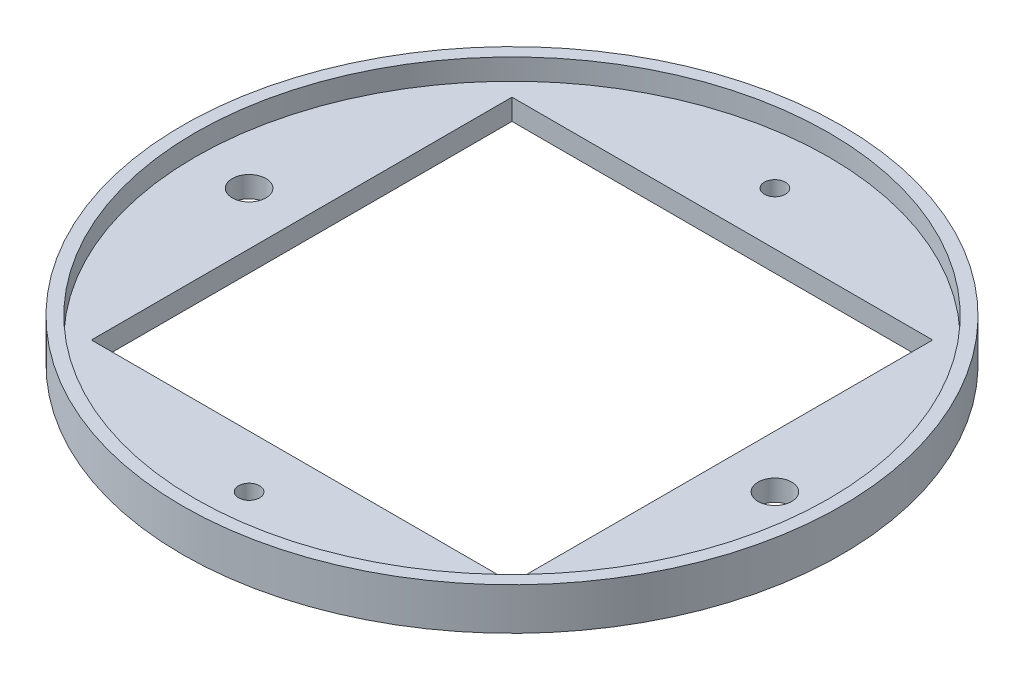
ISO-10303-21;
HEADER;
FILE_DESCRIPTION(('STEP AP214'),'2;1');
FILE_NAME('part.step','',(''),(''),'','','');
FILE_SCHEMA(('AUTOMOTIVE_DESIGN { 1 0 10303 214 1 1 1 1 }'));
ENDSEC;
DATA;
#1=APPLICATION_CONTEXT('core data for automotive mechanical design processes');
#2=APPLICATION_PROTOCOL_DEFINITION('international standard','automotive_design',2000,#1);
#3=PRODUCT_CONTEXT('',#1,'mechanical');
#4=PRODUCT('Part','Part','',(#3));
#5=PRODUCT_RELATED_PRODUCT_CATEGORY('part','',(#4));
#6=PRODUCT_DEFINITION_FORMATION('','',#4);
#7=PRODUCT_DEFINITION_CONTEXT('part definition',#1,'design');
#8=PRODUCT_DEFINITION('design','',#6,#7);
#9=PRODUCT_DEFINITION_SHAPE('','',#8);
#10=(LENGTH_UNIT() NAMED_UNIT(*) SI_UNIT(.MILLI.,.METRE.));
#11=(NAMED_UNIT(*) PLANE_ANGLE_UNIT() SI_UNIT($,.RADIAN.));
#12=(NAMED_UNIT(*) SI_UNIT($,.STERADIAN.) SOLID_ANGLE_UNIT());
#13=UNCERTAINTY_MEASURE_WITH_UNIT(LENGTH_MEASURE(1.E-05),#10,'distance_accuracy_value','');
#14=(GEOMETRIC_REPRESENTATION_CONTEXT(3) GLOBAL_UNCERTAINTY_ASSIGNED_CONTEXT((#13)) GLOBAL_UNIT_ASSIGNED_CONTEXT((#10,
#11,#12)) REPRESENTATION_CONTEXT('',''));
#15=CARTESIAN_POINT('',(0.,0.,0.));
#16=DIRECTION('',(0.,0.,1.));
#17=DIRECTION('',(1.,0.,0.));
#18=AXIS2_PLACEMENT_3D('',#15,#16,#17);
#19=CARTESIAN_POINT('',(0.,5.,0.));
#20=DIRECTION('',(0.,1.,0.));
#21=DIRECTION('',(0.,0.,1.));
#22=AXIS2_PLACEMENT_3D('',#19,#20,#21);
#23=PLANE('',#22);
#24=CARTESIAN_POINT('',(0.,5.,62.5));
#25=DIRECTION('',(0.,1.,0.));
#26=DIRECTION('',(0.,0.,1.));
#27=AXIS2_PLACEMENT_3D('',#24,#25,#26);
#28=CIRCLE('',#27,2.5);
#29=CARTESIAN_POINT('',(0.,5.,65.));
#30=VERTEX_POINT('',#29);
#31=EDGE_CURVE('E157',#30,#30,#28,.T.);
#32=ORIENTED_EDGE('',*,*,#31,.F.);
#33=EDGE_LOOP('',(#32));
#34=FACE_BOUND('',#33,.T.);
#35=CARTESIAN_POINT('',(62.5,5.,0.));
#36=DIRECTION('',(0.,1.,0.));
#37=DIRECTION('',(0.,0.,1.));
#38=AXIS2_PLACEMENT_3D('',#35,#36,#37);
#39=CIRCLE('',#38,4.00000000000001);
#40=CARTESIAN_POINT('',(62.5,5.,4.00000000000001));
#41=VERTEX_POINT('',#40);
#42=EDGE_CURVE('E174',#41,#41,#39,.T.);
#43=ORIENTED_EDGE('',*,*,#42,.F.);
#44=EDGE_LOOP('',(#43));
#45=FACE_BOUND('',#44,.T.);
#46=DIRECTION('',(-1.,0.,0.));
#47=VECTOR('',#46,1.);
#48=CARTESIAN_POINT('',(-50.,5.,-50.));
#49=LINE('',#48,#47);
#50=CARTESIAN_POINT('',(50.,5.,-50.));
#51=VERTEX_POINT('',#50);
#52=CARTESIAN_POINT('',(-50.,5.,-50.));
#53=VERTEX_POINT('',#52);
#54=EDGE_CURVE('E90',#51,#53,#49,.T.);
#55=ORIENTED_EDGE('',*,*,#54,.F.);
#56=DIRECTION('',(0.,0.,-1.));
#57=VECTOR('',#56,1.);
#58=CARTESIAN_POINT('',(50.,5.,50.));
#59=LINE('',#58,#57);
#60=CARTESIAN_POINT('',(50.,5.,50.));
#61=VERTEX_POINT('',#60);
#62=EDGE_CURVE('E81',#61,#51,#59,.T.);
#63=ORIENTED_EDGE('',*,*,#62,.F.);
#64=DIRECTION('',(1.,0.,0.));
#65=VECTOR('',#64,1.);
#66=CARTESIAN_POINT('',(-50.,5.,50.));
#67=LINE('',#66,#65);
#68=CARTESIAN_POINT('',(-50.,5.,50.));
#69=VERTEX_POINT('',#68);
#70=EDGE_CURVE('E107',#69,#61,#67,.T.);
#71=ORIENTED_EDGE('',*,*,#70,.F.);
#72=DIRECTION('',(0.,0.,1.));
#73=VECTOR('',#72,1.);
#74=CARTESIAN_POINT('',(-50.,5.,50.));
#75=LINE('',#74,#73);
#76=EDGE_CURVE('E103',#53,#69,#75,.T.);
#77=ORIENTED_EDGE('',*,*,#76,.F.);
#78=EDGE_LOOP('',(#55,#63,#71,#77));
#79=FACE_BOUND('',#78,.T.);
#80=CARTESIAN_POINT('',(-62.5,5.,0.));
#81=DIRECTION('',(0.,1.,0.));
#82=DIRECTION('',(0.,0.,1.));
#83=AXIS2_PLACEMENT_3D('',#80,#81,#82);
#84=CIRCLE('',#83,4.00000000000001);
#85=CARTESIAN_POINT('',(-62.5,5.,4.00000000000001));
#86=VERTEX_POINT('',#85);
#87=EDGE_CURVE('E115',#86,#86,#84,.T.);
#88=ORIENTED_EDGE('',*,*,#87,.F.);
#89=EDGE_LOOP('',(#88));
#90=FACE_BOUND('',#89,.T.);
#91=CARTESIAN_POINT('',(0.,5.,-62.5));
#92=DIRECTION('',(0.,1.,0.));
#93=DIRECTION('',(0.,0.,1.));
#94=AXIS2_PLACEMENT_3D('',#91,#92,#93);
#95=CIRCLE('',#94,2.5);
#96=CARTESIAN_POINT('',(0.,5.,-60.));
#97=VERTEX_POINT('',#96);
#98=EDGE_CURVE('E168',#97,#97,#95,.T.);
#99=ORIENTED_EDGE('',*,*,#98,.F.);
#100=EDGE_LOOP('',(#99));
#101=FACE_BOUND('',#100,.T.);
#102=CARTESIAN_POINT('',(0.,5.,0.));
#103=DIRECTION('',(0.,1.,0.));
#104=DIRECTION('',(0.,0.,1.));
#105=AXIS2_PLACEMENT_3D('',#102,#103,#104);
#106=CIRCLE('',#105,75.35);
#107=CARTESIAN_POINT('',(0.,5.,75.35));
#108=VERTEX_POINT('',#107);
#109=EDGE_CURVE('E11',#108,#108,#106,.F.);
#110=ORIENTED_EDGE('',*,*,#109,.F.);
#111=EDGE_LOOP('',(#110));
#112=FACE_BOUND('',#111,.T.);
#113=ADVANCED_FACE('F39',(#34,#45,#79,#90,#101,#112),#23,.T.);
#114=CARTESIAN_POINT('',(0.,0.,0.));
#115=DIRECTION('',(0.,1.,0.));
#116=DIRECTION('',(0.,0.,1.));
#117=AXIS2_PLACEMENT_3D('',#114,#115,#116);
#118=PLANE('',#117);
#119=CARTESIAN_POINT('',(0.,0.,0.));
#120=DIRECTION('',(0.,1.,0.));
#121=DIRECTION('',(0.,0.,1.));
#122=AXIS2_PLACEMENT_3D('',#119,#120,#121);
#123=CIRCLE('',#122,78.35);
#124=CARTESIAN_POINT('',(0.,0.,78.35));
#125=VERTEX_POINT('',#124);
#126=EDGE_CURVE('E48',#125,#125,#123,.T.);
#127=ORIENTED_EDGE('',*,*,#126,.F.);
#128=EDGE_LOOP('',(#127));
#129=FACE_BOUND('',#128,.T.);
#130=DIRECTION('',(0.,0.,-1.));
#131=VECTOR('',#130,1.);
#132=CARTESIAN_POINT('',(50.,0.,50.));
#133=LINE('',#132,#131);
#134=CARTESIAN_POINT('',(50.,0.,50.));
#135=VERTEX_POINT('',#134);
#136=CARTESIAN_POINT('',(50.,0.,-50.));
#137=VERTEX_POINT('',#136);
#138=EDGE_CURVE('E63',#135,#137,#133,.T.);
#139=ORIENTED_EDGE('',*,*,#138,.T.);
#140=DIRECTION('',(-1.,0.,0.));
#141=VECTOR('',#140,1.);
#142=CARTESIAN_POINT('',(-50.,0.,-50.));
#143=LINE('',#142,#141);
#144=CARTESIAN_POINT('',(-50.,0.,-50.));
#145=VERTEX_POINT('',#144);
#146=EDGE_CURVE('E97',#137,#145,#143,.T.);
#147=ORIENTED_EDGE('',*,*,#146,.T.);
#148=DIRECTION('',(0.,0.,1.));
#149=VECTOR('',#148,1.);
#150=CARTESIAN_POINT('',(-50.,0.,50.));
#151=LINE('',#150,#149);
#152=CARTESIAN_POINT('',(-50.,0.,50.));
#153=VERTEX_POINT('',#152);
#154=EDGE_CURVE('E118',#145,#153,#151,.T.);
#155=ORIENTED_EDGE('',*,*,#154,.T.);
#156=DIRECTION('',(1.,0.,0.));
#157=VECTOR('',#156,1.);
#158=CARTESIAN_POINT('',(-50.,0.,50.));
#159=LINE('',#158,#157);
#160=EDGE_CURVE('E91',#153,#135,#159,.T.);
#161=ORIENTED_EDGE('',*,*,#160,.T.);
#162=EDGE_LOOP('',(#139,#147,#155,#161));
#163=FACE_BOUND('',#162,.T.);
#164=CARTESIAN_POINT('',(-62.5,0.,0.));
#165=DIRECTION('',(0.,1.,0.));
#166=DIRECTION('',(0.,0.,1.));
#167=AXIS2_PLACEMENT_3D('',#164,#165,#166);
#168=CIRCLE('',#167,4.00000000000001);
#169=CARTESIAN_POINT('',(-62.5,0.,4.00000000000001));
#170=VERTEX_POINT('',#169);
#171=EDGE_CURVE('E143',#170,#170,#168,.T.);
#172=ORIENTED_EDGE('',*,*,#171,.T.);
#173=EDGE_LOOP('',(#172));
#174=FACE_BOUND('',#173,.T.);
#175=CARTESIAN_POINT('',(62.5,0.,0.));
#176=DIRECTION('',(0.,1.,0.));
#177=DIRECTION('',(0.,0.,1.));
#178=AXIS2_PLACEMENT_3D('',#175,#176,#177);
#179=CIRCLE('',#178,4.00000000000001);
#180=CARTESIAN_POINT('',(62.5,0.,4.00000000000001));
#181=VERTEX_POINT('',#180);
#182=EDGE_CURVE('E147',#181,#181,#179,.T.);
#183=ORIENTED_EDGE('',*,*,#182,.T.);
#184=EDGE_LOOP('',(#183));
#185=FACE_BOUND('',#184,.T.);
#186=CARTESIAN_POINT('',(0.,0.,-62.5));
#187=DIRECTION('',(0.,1.,0.));
#188=DIRECTION('',(0.,0.,1.));
#189=AXIS2_PLACEMENT_3D('',#186,#187,#188);
#190=CIRCLE('',#189,2.5);
#191=CARTESIAN_POINT('',(0.,0.,-60.));
#192=VERTEX_POINT('',#191);
#193=EDGE_CURVE('E151',#192,#192,#190,.T.);
#194=ORIENTED_EDGE('',*,*,#193,.T.);
#195=EDGE_LOOP('',(#194));
#196=FACE_BOUND('',#195,.T.);
#197=CARTESIAN_POINT('',(0.,0.,62.5));
#198=DIRECTION('',(0.,1.,0.));
#199=DIRECTION('',(0.,0.,1.));
#200=AXIS2_PLACEMENT_3D('',#197,#198,#199);
#201=CIRCLE('',#200,2.5);
#202=CARTESIAN_POINT('',(0.,0.,65.));
#203=VERTEX_POINT('',#202);
#204=EDGE_CURVE('E154',#203,#203,#201,.T.);
#205=ORIENTED_EDGE('',*,*,#204,.T.);
#206=EDGE_LOOP('',(#205));
#207=FACE_BOUND('',#206,.T.);
#208=ADVANCED_FACE('F136',(#129,#163,#174,#185,#196,#207),#118,.F.);
#209=CARTESIAN_POINT('',(0.,5.,0.));
#210=DIRECTION('',(0.,-1.,0.));
#211=DIRECTION('',(0.,0.,-1.));
#212=AXIS2_PLACEMENT_3D('',#209,#210,#211);
#213=CYLINDRICAL_SURFACE('',#212,78.35);
#214=ORIENTED_EDGE('',*,*,#126,.T.);
#215=EDGE_LOOP('',(#214));
#216=FACE_BOUND('',#215,.T.);
#217=CARTESIAN_POINT('',(0.,10.,0.));
#218=DIRECTION('',(0.,1.,0.));
#219=DIRECTION('',(0.,0.,1.));
#220=AXIS2_PLACEMENT_3D('',#217,#218,#219);
#221=CIRCLE('',#220,78.35);
#222=CARTESIAN_POINT('',(0.,10.,78.35));
#223=VERTEX_POINT('',#222);
#224=EDGE_CURVE('E158',#223,#223,#221,.T.);
#225=ORIENTED_EDGE('',*,*,#224,.F.);
#226=EDGE_LOOP('',(#225));
#227=FACE_BOUND('',#226,.T.);
#228=ADVANCED_FACE('F41',(#216,#227),#213,.T.);
#229=CARTESIAN_POINT('',(50.,5.,50.));
#230=DIRECTION('',(-1.,0.,0.));
#231=DIRECTION('',(0.,0.,1.));
#232=AXIS2_PLACEMENT_3D('',#229,#230,#231);
#233=PLANE('',#232);
#234=ORIENTED_EDGE('',*,*,#138,.F.);
#235=DIRECTION('',(0.,-1.,0.));
#236=VECTOR('',#235,1.);
#237=CARTESIAN_POINT('',(50.,5.,50.));
#238=LINE('',#237,#236);
#239=EDGE_CURVE('E85',#61,#135,#238,.T.);
#240=ORIENTED_EDGE('',*,*,#239,.F.);
#241=ORIENTED_EDGE('',*,*,#62,.T.);
#242=DIRECTION('',(0.,-1.,0.));
#243=VECTOR('',#242,1.);
#244=CARTESIAN_POINT('',(50.,5.,-50.));
#245=LINE('',#244,#243);
#246=EDGE_CURVE('E84',#51,#137,#245,.T.);
#247=ORIENTED_EDGE('',*,*,#246,.T.);
#248=EDGE_LOOP('',(#234,#240,#241,#247));
#249=FACE_BOUND('',#248,.T.);
#250=ADVANCED_FACE('F83',(#249),#233,.T.);
#251=CARTESIAN_POINT('',(-50.,5.,-50.));
#252=DIRECTION('',(0.,0.,1.));
#253=DIRECTION('',(1.,0.,0.));
#254=AXIS2_PLACEMENT_3D('',#251,#252,#253);
#255=PLANE('',#254);
#256=ORIENTED_EDGE('',*,*,#146,.F.);
#257=ORIENTED_EDGE('',*,*,#246,.F.);
#258=ORIENTED_EDGE('',*,*,#54,.T.);
#259=DIRECTION('',(0.,-1.,0.));
#260=VECTOR('',#259,1.);
#261=CARTESIAN_POINT('',(-50.,5.,-50.));
#262=LINE('',#261,#260);
#263=EDGE_CURVE('E99',#53,#145,#262,.T.);
#264=ORIENTED_EDGE('',*,*,#263,.T.);
#265=EDGE_LOOP('',(#256,#257,#258,#264));
#266=FACE_BOUND('',#265,.T.);
#267=ADVANCED_FACE('F94',(#266),#255,.T.);
#268=CARTESIAN_POINT('',(-50.,5.,50.));
#269=DIRECTION('',(1.,0.,0.));
#270=DIRECTION('',(0.,0.,-1.));
#271=AXIS2_PLACEMENT_3D('',#268,#269,#270);
#272=PLANE('',#271);
#273=ORIENTED_EDGE('',*,*,#154,.F.);
#274=ORIENTED_EDGE('',*,*,#263,.F.);
#275=ORIENTED_EDGE('',*,*,#76,.T.);
#276=DIRECTION('',(0.,-1.,0.));
#277=VECTOR('',#276,1.);
#278=CARTESIAN_POINT('',(-50.,5.,50.));
#279=LINE('',#278,#277);
#280=EDGE_CURVE('E55',#69,#153,#279,.T.);
#281=ORIENTED_EDGE('',*,*,#280,.T.);
#282=EDGE_LOOP('',(#273,#274,#275,#281));
#283=FACE_BOUND('',#282,.T.);
#284=ADVANCED_FACE('F224',(#283),#272,.T.);
#285=CARTESIAN_POINT('',(-50.,5.,50.));
#286=DIRECTION('',(0.,0.,-1.));
#287=DIRECTION('',(-1.,0.,0.));
#288=AXIS2_PLACEMENT_3D('',#285,#286,#287);
#289=PLANE('',#288);
#290=ORIENTED_EDGE('',*,*,#160,.F.);
#291=ORIENTED_EDGE('',*,*,#280,.F.);
#292=ORIENTED_EDGE('',*,*,#70,.T.);
#293=ORIENTED_EDGE('',*,*,#239,.T.);
#294=EDGE_LOOP('',(#290,#291,#292,#293));
#295=FACE_BOUND('',#294,.T.);
#296=ADVANCED_FACE('F221',(#295),#289,.T.);
#297=CARTESIAN_POINT('',(-62.5,5.,0.));
#298=DIRECTION('',(0.,-1.,0.));
#299=DIRECTION('',(0.,0.,-1.));
#300=AXIS2_PLACEMENT_3D('',#297,#298,#299);
#301=CYLINDRICAL_SURFACE('',#300,4.00000000000001);
#302=ORIENTED_EDGE('',*,*,#87,.T.);
#303=EDGE_LOOP('',(#302));
#304=FACE_BOUND('',#303,.T.);
#305=ORIENTED_EDGE('',*,*,#171,.F.);
#306=EDGE_LOOP('',(#305));
#307=FACE_BOUND('',#306,.T.);
#308=ADVANCED_FACE('F185',(#304,#307),#301,.F.);
#309=CARTESIAN_POINT('',(62.5,5.,0.));
#310=DIRECTION('',(0.,-1.,0.));
#311=DIRECTION('',(0.,0.,-1.));
#312=AXIS2_PLACEMENT_3D('',#309,#310,#311);
#313=CYLINDRICAL_SURFACE('',#312,4.00000000000001);
#314=ORIENTED_EDGE('',*,*,#42,.T.);
#315=EDGE_LOOP('',(#314));
#316=FACE_BOUND('',#315,.T.);
#317=ORIENTED_EDGE('',*,*,#182,.F.);
#318=EDGE_LOOP('',(#317));
#319=FACE_BOUND('',#318,.T.);
#320=ADVANCED_FACE('F214',(#316,#319),#313,.F.);
#321=CARTESIAN_POINT('',(0.,5.,-62.5));
#322=DIRECTION('',(0.,-1.,0.));
#323=DIRECTION('',(0.,0.,-1.));
#324=AXIS2_PLACEMENT_3D('',#321,#322,#323);
#325=CYLINDRICAL_SURFACE('',#324,2.5);
#326=ORIENTED_EDGE('',*,*,#98,.T.);
#327=EDGE_LOOP('',(#326));
#328=FACE_BOUND('',#327,.T.);
#329=ORIENTED_EDGE('',*,*,#193,.F.);
#330=EDGE_LOOP('',(#329));
#331=FACE_BOUND('',#330,.T.);
#332=ADVANCED_FACE('F210',(#328,#331),#325,.F.);
#333=CARTESIAN_POINT('',(0.,5.,62.5));
#334=DIRECTION('',(0.,-1.,0.));
#335=DIRECTION('',(0.,0.,-1.));
#336=AXIS2_PLACEMENT_3D('',#333,#334,#335);
#337=CYLINDRICAL_SURFACE('',#336,2.5);
#338=ORIENTED_EDGE('',*,*,#31,.T.);
#339=EDGE_LOOP('',(#338));
#340=FACE_BOUND('',#339,.T.);
#341=ORIENTED_EDGE('',*,*,#204,.F.);
#342=EDGE_LOOP('',(#341));
#343=FACE_BOUND('',#342,.T.);
#344=ADVANCED_FACE('F203',(#340,#343),#337,.F.);
#345=CARTESIAN_POINT('',(0.,10.,0.));
#346=DIRECTION('',(0.,1.,0.));
#347=DIRECTION('',(0.,0.,1.));
#348=AXIS2_PLACEMENT_3D('',#345,#346,#347);
#349=PLANE('',#348);
#350=ORIENTED_EDGE('',*,*,#224,.T.);
#351=EDGE_LOOP('',(#350));
#352=FACE_BOUND('',#351,.T.);
#353=CARTESIAN_POINT('',(0.,10.,0.));
#354=DIRECTION('',(0.,1.,0.));
#355=DIRECTION('',(0.,0.,1.));
#356=AXIS2_PLACEMENT_3D('',#353,#354,#355);
#357=CIRCLE('',#356,75.35);
#358=CARTESIAN_POINT('',(0.,10.,75.35));
#359=VERTEX_POINT('',#358);
#360=EDGE_CURVE('E165',#359,#359,#357,.T.);
#361=ORIENTED_EDGE('',*,*,#360,.F.);
#362=EDGE_LOOP('',(#361));
#363=FACE_BOUND('',#362,.T.);
#364=ADVANCED_FACE('F197',(#352,#363),#349,.T.);
#365=CARTESIAN_POINT('',(0.,10.,0.));
#366=DIRECTION('',(0.,-1.,0.));
#367=DIRECTION('',(0.,0.,-1.));
#368=AXIS2_PLACEMENT_3D('',#365,#366,#367);
#369=CYLINDRICAL_SURFACE('',#368,75.35);
#370=ORIENTED_EDGE('',*,*,#360,.T.);
#371=EDGE_LOOP('',(#370));
#372=FACE_BOUND('',#371,.T.);
#373=ORIENTED_EDGE('',*,*,#109,.T.);
#374=EDGE_LOOP('',(#373));
#375=FACE_BOUND('',#374,.T.);
#376=ADVANCED_FACE('F195',(#372,#375),#369,.F.);
#377=CLOSED_SHELL('',(#113,#208,#228,#250,#267,#284,#296,#308,#320,#332,#344,#364,#376));
#378=MANIFOLD_SOLID_BREP('B2',#377);
#379=ADVANCED_BREP_SHAPE_REPRESENTATION('',(#18,#378),#14);
#380=SHAPE_DEFINITION_REPRESENTATION(#9,#379);
ENDSEC;
END-ISO-10303-21;
